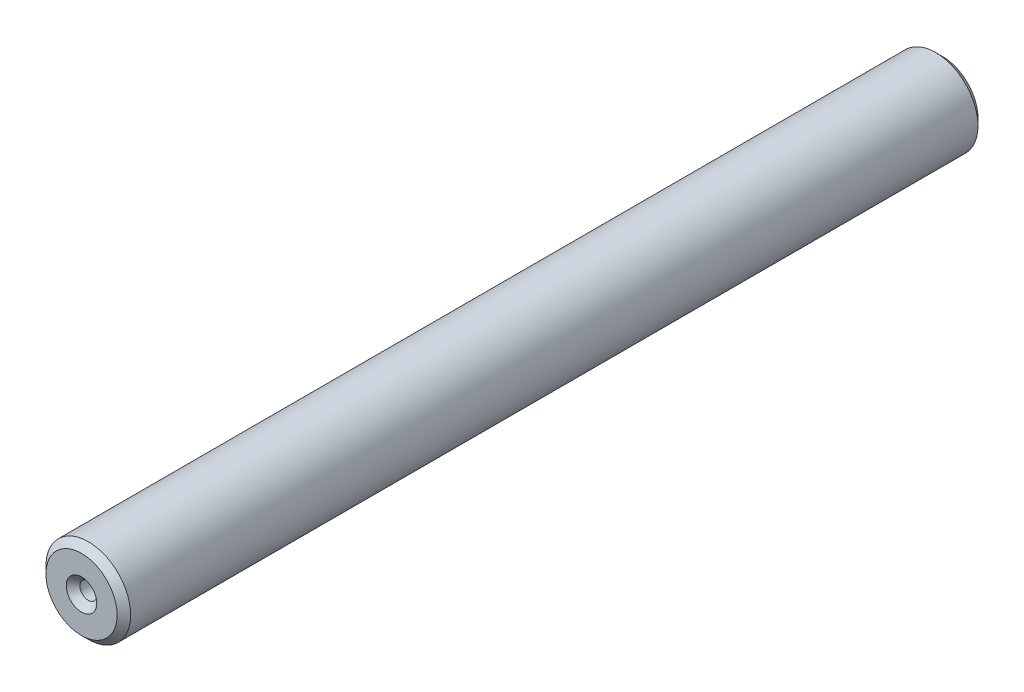
ISO-10303-21;
HEADER;
FILE_DESCRIPTION(('STEP AP214'),'2;1');
FILE_NAME('part.step','',(''),(''),'','','');
FILE_SCHEMA(('AUTOMOTIVE_DESIGN { 1 0 10303 214 1 1 1 1 }'));
ENDSEC;
DATA;
#1=APPLICATION_CONTEXT('core data for automotive mechanical design processes');
#2=APPLICATION_PROTOCOL_DEFINITION('international standard','automotive_design',2000,#1);
#3=PRODUCT_CONTEXT('',#1,'mechanical');
#4=PRODUCT('Part','Part','',(#3));
#5=PRODUCT_RELATED_PRODUCT_CATEGORY('part','',(#4));
#6=PRODUCT_DEFINITION_FORMATION('','',#4);
#7=PRODUCT_DEFINITION_CONTEXT('part definition',#1,'design');
#8=PRODUCT_DEFINITION('design','',#6,#7);
#9=PRODUCT_DEFINITION_SHAPE('','',#8);
#10=(LENGTH_UNIT() NAMED_UNIT(*) SI_UNIT(.MILLI.,.METRE.));
#11=(NAMED_UNIT(*) PLANE_ANGLE_UNIT() SI_UNIT($,.RADIAN.));
#12=(NAMED_UNIT(*) SI_UNIT($,.STERADIAN.) SOLID_ANGLE_UNIT());
#13=UNCERTAINTY_MEASURE_WITH_UNIT(LENGTH_MEASURE(1.E-05),#10,'distance_accuracy_value','');
#14=(GEOMETRIC_REPRESENTATION_CONTEXT(3) GLOBAL_UNCERTAINTY_ASSIGNED_CONTEXT((#13)) GLOBAL_UNIT_ASSIGNED_CONTEXT((#10,
#11,#12)) REPRESENTATION_CONTEXT('',''));
#15=CARTESIAN_POINT('',(0.,0.,0.));
#16=DIRECTION('',(0.,0.,1.));
#17=DIRECTION('',(1.,0.,0.));
#18=AXIS2_PLACEMENT_3D('',#15,#16,#17);
#19=CARTESIAN_POINT('',(0.,0.,127.));
#20=DIRECTION('',(0.,0.,1.));
#21=DIRECTION('',(1.,0.,0.));
#22=AXIS2_PLACEMENT_3D('',#19,#20,#21);
#23=PLANE('',#22);
#24=CARTESIAN_POINT('',(0.,0.,127.));
#25=DIRECTION('',(0.,0.,1.));
#26=DIRECTION('',(1.,0.,0.));
#27=AXIS2_PLACEMENT_3D('',#24,#25,#26);
#28=CIRCLE('',#27,4.49999999999995);
#29=CARTESIAN_POINT('',(4.49999999999995,0.,127.));
#30=VERTEX_POINT('',#29);
#31=EDGE_CURVE('E10',#30,#30,#28,.F.);
#32=ORIENTED_EDGE('',*,*,#31,.T.);
#33=EDGE_LOOP('',(#32));
#34=FACE_BOUND('',#33,.T.);
#35=CARTESIAN_POINT('',(0.,0.,127.));
#36=DIRECTION('',(0.,0.,1.));
#37=DIRECTION('',(1.,0.,0.));
#38=AXIS2_PLACEMENT_3D('',#35,#36,#37);
#39=CIRCLE('',#38,10.4999999999999);
#40=CARTESIAN_POINT('',(10.4999999999999,0.,127.));
#41=VERTEX_POINT('',#40);
#42=EDGE_CURVE('E48',#41,#41,#39,.T.);
#43=ORIENTED_EDGE('',*,*,#42,.T.);
#44=EDGE_LOOP('',(#43));
#45=FACE_BOUND('',#44,.T.);
#46=ADVANCED_FACE('F39',(#34,#45),#23,.T.);
#47=CARTESIAN_POINT('',(0.,0.,-127.));
#48=DIRECTION('',(0.,0.,1.));
#49=DIRECTION('',(1.,0.,0.));
#50=AXIS2_PLACEMENT_3D('',#47,#48,#49);
#51=PLANE('',#50);
#52=CARTESIAN_POINT('',(0.,0.,-127.));
#53=DIRECTION('',(0.,0.,1.));
#54=DIRECTION('',(1.,0.,0.));
#55=AXIS2_PLACEMENT_3D('',#52,#53,#54);
#56=CIRCLE('',#55,4.5);
#57=CARTESIAN_POINT('',(4.5,0.,-127.));
#58=VERTEX_POINT('',#57);
#59=EDGE_CURVE('E72',#58,#58,#56,.T.);
#60=ORIENTED_EDGE('',*,*,#59,.T.);
#61=EDGE_LOOP('',(#60));
#62=FACE_BOUND('',#61,.T.);
#63=CARTESIAN_POINT('',(0.,0.,-127.));
#64=DIRECTION('',(0.,0.,1.));
#65=DIRECTION('',(1.,0.,0.));
#66=AXIS2_PLACEMENT_3D('',#63,#64,#65);
#67=CIRCLE('',#66,10.5);
#68=CARTESIAN_POINT('',(10.5,0.,-127.));
#69=VERTEX_POINT('',#68);
#70=EDGE_CURVE('E76',#69,#69,#67,.F.);
#71=ORIENTED_EDGE('',*,*,#70,.T.);
#72=EDGE_LOOP('',(#71));
#73=FACE_BOUND('',#72,.T.);
#74=ADVANCED_FACE('F81',(#62,#73),#51,.F.);
#75=CARTESIAN_POINT('',(0.,0.,127.));
#76=DIRECTION('',(0.,0.,-1.));
#77=DIRECTION('',(-1.,0.,0.));
#78=AXIS2_PLACEMENT_3D('',#75,#76,#77);
#79=CYLINDRICAL_SURFACE('',#78,12.5);
#80=CARTESIAN_POINT('',(0.,0.,-125.));
#81=DIRECTION('',(0.,0.,1.));
#82=DIRECTION('',(1.,0.,0.));
#83=AXIS2_PLACEMENT_3D('',#80,#81,#82);
#84=CIRCLE('',#83,12.5);
#85=CARTESIAN_POINT('',(12.5,0.,-125.));
#86=VERTEX_POINT('',#85);
#87=EDGE_CURVE('E53',#86,#86,#84,.T.);
#88=ORIENTED_EDGE('',*,*,#87,.T.);
#89=EDGE_LOOP('',(#88));
#90=FACE_BOUND('',#89,.T.);
#91=CARTESIAN_POINT('',(0.,0.,125.));
#92=DIRECTION('',(0.,0.,1.));
#93=DIRECTION('',(1.,0.,0.));
#94=AXIS2_PLACEMENT_3D('',#91,#92,#93);
#95=CIRCLE('',#94,12.5);
#96=CARTESIAN_POINT('',(12.5,0.,125.));
#97=VERTEX_POINT('',#96);
#98=EDGE_CURVE('E58',#97,#97,#95,.F.);
#99=ORIENTED_EDGE('',*,*,#98,.T.);
#100=EDGE_LOOP('',(#99));
#101=FACE_BOUND('',#100,.T.);
#102=ADVANCED_FACE('F91',(#90,#101),#79,.T.);
#103=CARTESIAN_POINT('',(0.,0.,127.));
#104=DIRECTION('',(0.,0.,-1.));
#105=DIRECTION('',(-1.,0.,0.));
#106=AXIS2_PLACEMENT_3D('',#103,#104,#105);
#107=CYLINDRICAL_SURFACE('',#106,2.5);
#108=CARTESIAN_POINT('',(0.,0.,-125.));
#109=DIRECTION('',(0.,0.,1.));
#110=DIRECTION('',(1.,0.,0.));
#111=AXIS2_PLACEMENT_3D('',#108,#109,#110);
#112=CIRCLE('',#111,2.5);
#113=CARTESIAN_POINT('',(2.5,0.,-125.));
#114=VERTEX_POINT('',#113);
#115=EDGE_CURVE('E64',#114,#114,#112,.F.);
#116=ORIENTED_EDGE('',*,*,#115,.T.);
#117=EDGE_LOOP('',(#116));
#118=FACE_BOUND('',#117,.T.);
#119=CARTESIAN_POINT('',(0.,0.,125.));
#120=DIRECTION('',(0.,0.,1.));
#121=DIRECTION('',(1.,0.,0.));
#122=AXIS2_PLACEMENT_3D('',#119,#120,#121);
#123=CIRCLE('',#122,2.5);
#124=CARTESIAN_POINT('',(2.5,0.,125.));
#125=VERTEX_POINT('',#124);
#126=EDGE_CURVE('E68',#125,#125,#123,.T.);
#127=ORIENTED_EDGE('',*,*,#126,.T.);
#128=EDGE_LOOP('',(#127));
#129=FACE_BOUND('',#128,.T.);
#130=ADVANCED_FACE('F94',(#118,#129),#107,.F.);
#131=CARTESIAN_POINT('',(0.,0.,-127.));
#132=DIRECTION('',(0.,0.,-1.));
#133=DIRECTION('',(-1.,0.,0.));
#134=AXIS2_PLACEMENT_3D('',#131,#132,#133);
#135=CONICAL_SURFACE('',#134,4.5,0.785398163397449);
#136=ORIENTED_EDGE('',*,*,#115,.F.);
#137=EDGE_LOOP('',(#136));
#138=FACE_BOUND('',#137,.T.);
#139=ORIENTED_EDGE('',*,*,#59,.F.);
#140=EDGE_LOOP('',(#139));
#141=FACE_BOUND('',#140,.T.);
#142=ADVANCED_FACE('F87',(#138,#141),#135,.F.);
#143=CARTESIAN_POINT('',(0.,0.,-125.));
#144=DIRECTION('',(0.,0.,1.));
#145=DIRECTION('',(1.,0.,0.));
#146=AXIS2_PLACEMENT_3D('',#143,#144,#145);
#147=CONICAL_SURFACE('',#146,12.5,0.785398163397438);
#148=ORIENTED_EDGE('',*,*,#70,.F.);
#149=EDGE_LOOP('',(#148));
#150=FACE_BOUND('',#149,.T.);
#151=ORIENTED_EDGE('',*,*,#87,.F.);
#152=EDGE_LOOP('',(#151));
#153=FACE_BOUND('',#152,.T.);
#154=ADVANCED_FACE('F83',(#150,#153),#147,.T.);
#155=CARTESIAN_POINT('',(0.,0.,125.));
#156=DIRECTION('',(0.,0.,1.));
#157=DIRECTION('',(1.,0.,0.));
#158=AXIS2_PLACEMENT_3D('',#155,#156,#157);
#159=CONICAL_SURFACE('',#158,2.5,0.785398163397442);
#160=ORIENTED_EDGE('',*,*,#31,.F.);
#161=EDGE_LOOP('',(#160));
#162=FACE_BOUND('',#161,.T.);
#163=ORIENTED_EDGE('',*,*,#126,.F.);
#164=EDGE_LOOP('',(#163));
#165=FACE_BOUND('',#164,.T.);
#166=ADVANCED_FACE('F86',(#162,#165),#159,.F.);
#167=CARTESIAN_POINT('',(0.,0.,127.));
#168=DIRECTION('',(0.,0.,-1.));
#169=DIRECTION('',(-1.,0.,0.));
#170=AXIS2_PLACEMENT_3D('',#167,#168,#169);
#171=CONICAL_SURFACE('',#170,10.4999999999999,0.785398163397451);
#172=ORIENTED_EDGE('',*,*,#98,.F.);
#173=EDGE_LOOP('',(#172));
#174=FACE_BOUND('',#173,.T.);
#175=ORIENTED_EDGE('',*,*,#42,.F.);
#176=EDGE_LOOP('',(#175));
#177=FACE_BOUND('',#176,.T.);
#178=ADVANCED_FACE('F42',(#174,#177),#171,.T.);
#179=CLOSED_SHELL('',(#46,#74,#102,#130,#142,#154,#166,#178));
#180=MANIFOLD_SOLID_BREP('B2',#179);
#181=ADVANCED_BREP_SHAPE_REPRESENTATION('',(#18,#180),#14);
#182=SHAPE_DEFINITION_REPRESENTATION(#9,#181);
ENDSEC;
END-ISO-10303-21;
